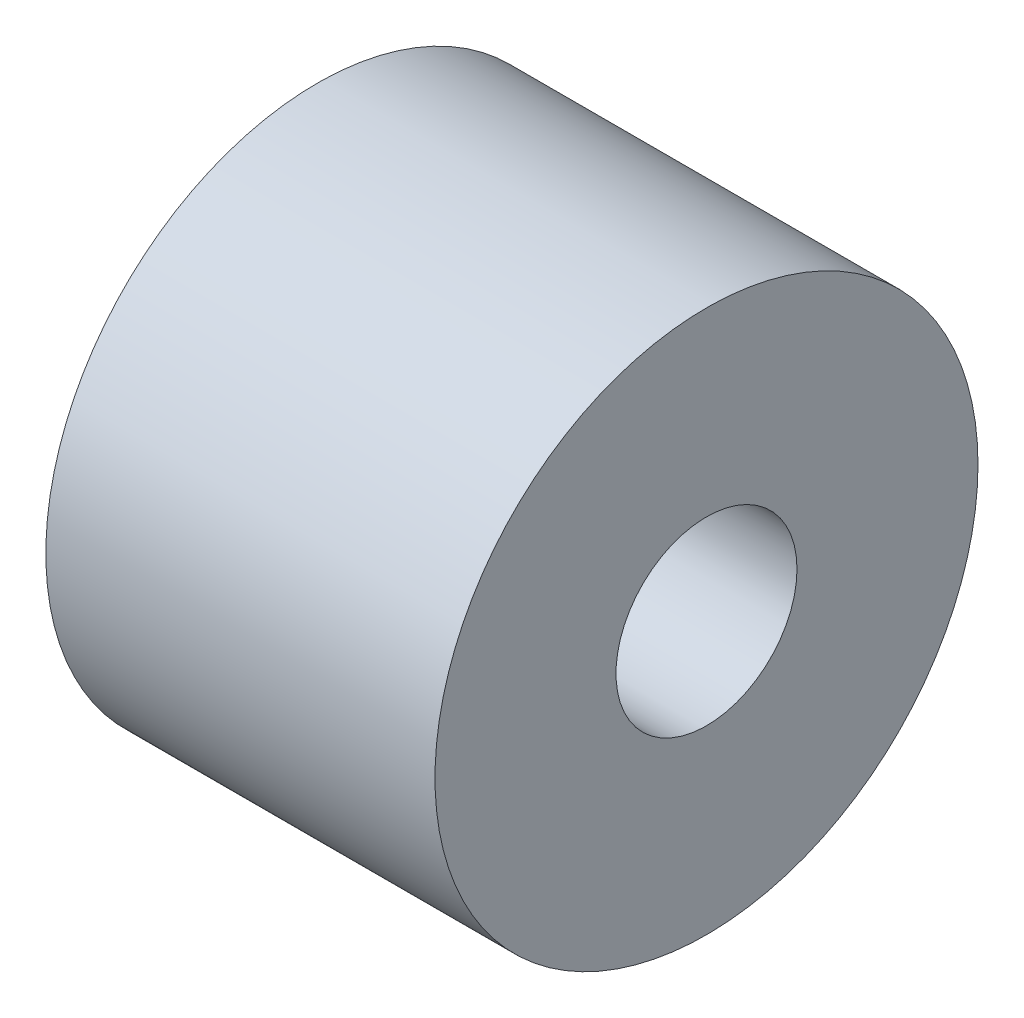
ISO-10303-21;
HEADER;
FILE_DESCRIPTION(('STEP AP214'),'2;1');
FILE_NAME('part.step','',(''),(''),'','','');
FILE_SCHEMA(('AUTOMOTIVE_DESIGN { 1 0 10303 214 1 1 1 1 }'));
ENDSEC;
DATA;
#1=APPLICATION_CONTEXT('core data for automotive mechanical design processes');
#2=APPLICATION_PROTOCOL_DEFINITION('international standard','automotive_design',2000,#1);
#3=PRODUCT_CONTEXT('',#1,'mechanical');
#4=PRODUCT('Part','Part','',(#3));
#5=PRODUCT_RELATED_PRODUCT_CATEGORY('part','',(#4));
#6=PRODUCT_DEFINITION_FORMATION('','',#4);
#7=PRODUCT_DEFINITION_CONTEXT('part definition',#1,'design');
#8=PRODUCT_DEFINITION('design','',#6,#7);
#9=PRODUCT_DEFINITION_SHAPE('','',#8);
#10=(LENGTH_UNIT() NAMED_UNIT(*) SI_UNIT(.MILLI.,.METRE.));
#11=(NAMED_UNIT(*) PLANE_ANGLE_UNIT() SI_UNIT($,.RADIAN.));
#12=(NAMED_UNIT(*) SI_UNIT($,.STERADIAN.) SOLID_ANGLE_UNIT());
#13=UNCERTAINTY_MEASURE_WITH_UNIT(LENGTH_MEASURE(1.E-05),#10,'distance_accuracy_value','');
#14=(GEOMETRIC_REPRESENTATION_CONTEXT(3) GLOBAL_UNCERTAINTY_ASSIGNED_CONTEXT((#13)) GLOBAL_UNIT_ASSIGNED_CONTEXT((#10,
#11,#12)) REPRESENTATION_CONTEXT('',''));
#15=CARTESIAN_POINT('',(0.,0.,0.));
#16=DIRECTION('',(0.,0.,1.));
#17=DIRECTION('',(1.,0.,0.));
#18=AXIS2_PLACEMENT_3D('',#15,#16,#17);
#19=CARTESIAN_POINT('',(21.5,0.,0.));
#20=DIRECTION('',(1.,0.,0.));
#21=DIRECTION('',(0.,0.,-1.));
#22=AXIS2_PLACEMENT_3D('',#19,#20,#21);
#23=PLANE('',#22);
#24=CARTESIAN_POINT('',(21.5,0.,0.));
#25=DIRECTION('',(1.,0.,0.));
#26=DIRECTION('',(0.,0.,-1.));
#27=AXIS2_PLACEMENT_3D('',#24,#25,#26);
#28=CIRCLE('',#27,15.);
#29=CARTESIAN_POINT('',(21.5,0.,-15.));
#30=VERTEX_POINT('',#29);
#31=EDGE_CURVE('E10',#30,#30,#28,.T.);
#32=ORIENTED_EDGE('',*,*,#31,.T.);
#33=EDGE_LOOP('',(#32));
#34=FACE_BOUND('',#33,.T.);
#35=CARTESIAN_POINT('',(21.5,0.,0.));
#36=DIRECTION('',(1.,0.,0.));
#37=DIRECTION('',(0.,0.,-1.));
#38=AXIS2_PLACEMENT_3D('',#35,#36,#37);
#39=CIRCLE('',#38,5.);
#40=CARTESIAN_POINT('',(21.5,0.,-5.));
#41=VERTEX_POINT('',#40);
#42=EDGE_CURVE('E41',#41,#41,#39,.T.);
#43=ORIENTED_EDGE('',*,*,#42,.F.);
#44=EDGE_LOOP('',(#43));
#45=FACE_BOUND('',#44,.T.);
#46=ADVANCED_FACE('F30',(#34,#45),#23,.T.);
#47=CARTESIAN_POINT('',(0.,0.,0.));
#48=DIRECTION('',(1.,0.,0.));
#49=DIRECTION('',(0.,0.,-1.));
#50=AXIS2_PLACEMENT_3D('',#47,#48,#49);
#51=PLANE('',#50);
#52=CARTESIAN_POINT('',(0.,0.,0.));
#53=DIRECTION('',(1.,0.,0.));
#54=DIRECTION('',(0.,0.,-1.));
#55=AXIS2_PLACEMENT_3D('',#52,#53,#54);
#56=CIRCLE('',#55,15.);
#57=CARTESIAN_POINT('',(0.,0.,-15.));
#58=VERTEX_POINT('',#57);
#59=EDGE_CURVE('E34',#58,#58,#56,.T.);
#60=ORIENTED_EDGE('',*,*,#59,.F.);
#61=EDGE_LOOP('',(#60));
#62=FACE_BOUND('',#61,.T.);
#63=CARTESIAN_POINT('',(0.,0.,0.));
#64=DIRECTION('',(1.,0.,0.));
#65=DIRECTION('',(0.,0.,-1.));
#66=AXIS2_PLACEMENT_3D('',#63,#64,#65);
#67=CIRCLE('',#66,5.);
#68=CARTESIAN_POINT('',(0.,0.,-5.));
#69=VERTEX_POINT('',#68);
#70=EDGE_CURVE('E43',#69,#69,#67,.T.);
#71=ORIENTED_EDGE('',*,*,#70,.T.);
#72=EDGE_LOOP('',(#71));
#73=FACE_BOUND('',#72,.T.);
#74=ADVANCED_FACE('F53',(#62,#73),#51,.F.);
#75=CARTESIAN_POINT('',(21.5,0.,0.));
#76=DIRECTION('',(-1.,0.,0.));
#77=DIRECTION('',(0.,0.,1.));
#78=AXIS2_PLACEMENT_3D('',#75,#76,#77);
#79=CYLINDRICAL_SURFACE('',#78,15.);
#80=ORIENTED_EDGE('',*,*,#31,.F.);
#81=EDGE_LOOP('',(#80));
#82=FACE_BOUND('',#81,.T.);
#83=ORIENTED_EDGE('',*,*,#59,.T.);
#84=EDGE_LOOP('',(#83));
#85=FACE_BOUND('',#84,.T.);
#86=ADVANCED_FACE('F32',(#82,#85),#79,.T.);
#87=CARTESIAN_POINT('',(21.5,0.,0.));
#88=DIRECTION('',(-1.,0.,0.));
#89=DIRECTION('',(0.,0.,1.));
#90=AXIS2_PLACEMENT_3D('',#87,#88,#89);
#91=CYLINDRICAL_SURFACE('',#90,5.);
#92=ORIENTED_EDGE('',*,*,#42,.T.);
#93=EDGE_LOOP('',(#92));
#94=FACE_BOUND('',#93,.T.);
#95=ORIENTED_EDGE('',*,*,#70,.F.);
#96=EDGE_LOOP('',(#95));
#97=FACE_BOUND('',#96,.T.);
#98=ADVANCED_FACE('F49',(#94,#97),#91,.F.);
#99=CLOSED_SHELL('',(#46,#74,#86,#98));
#100=MANIFOLD_SOLID_BREP('B2',#99);
#101=ADVANCED_BREP_SHAPE_REPRESENTATION('',(#18,#100),#14);
#102=SHAPE_DEFINITION_REPRESENTATION(#9,#101);
ENDSEC;
END-ISO-10303-21;
